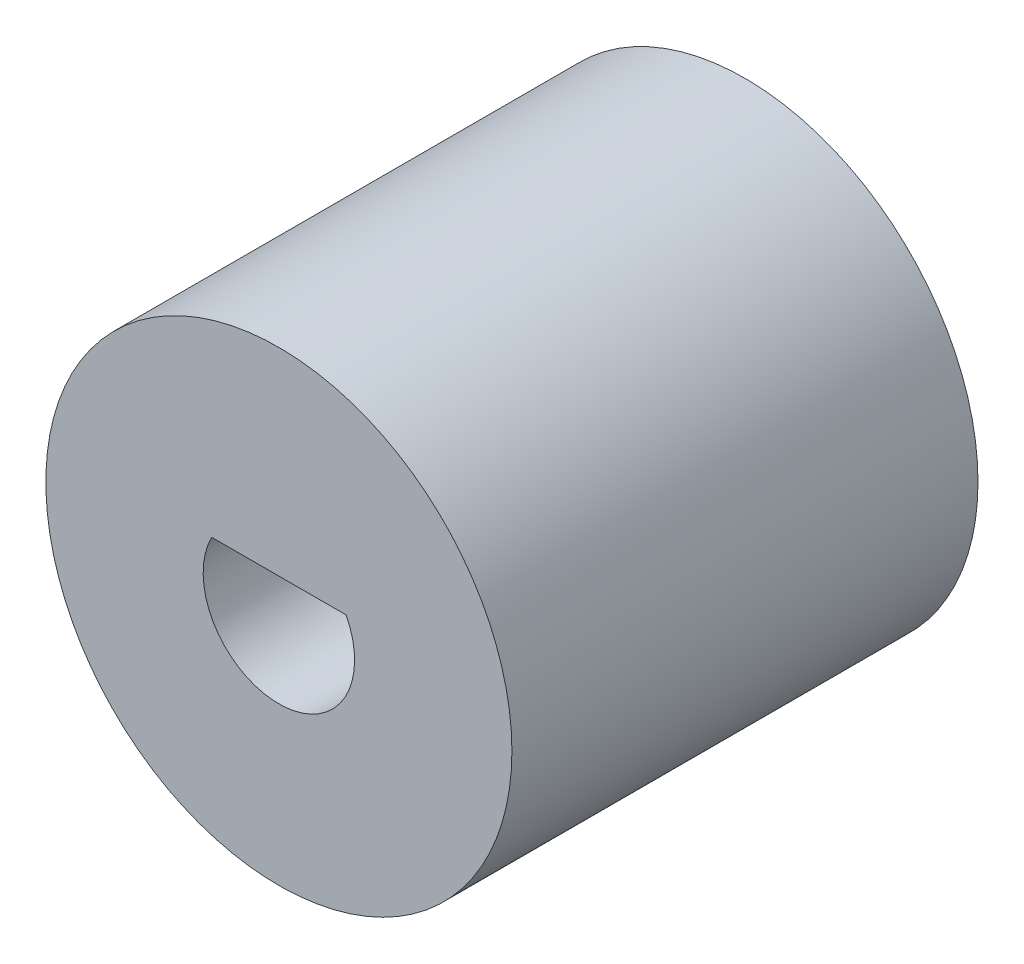
ISO-10303-21;
HEADER;
FILE_DESCRIPTION(('STEP AP214'),'2;1');
FILE_NAME('part.step','',(''),(''),'','','');
FILE_SCHEMA(('AUTOMOTIVE_DESIGN { 1 0 10303 214 1 1 1 1 }'));
ENDSEC;
DATA;
#1=APPLICATION_CONTEXT('core data for automotive mechanical design processes');
#2=APPLICATION_PROTOCOL_DEFINITION('international standard','automotive_design',2000,#1);
#3=PRODUCT_CONTEXT('',#1,'mechanical');
#4=PRODUCT('Part','Part','',(#3));
#5=PRODUCT_RELATED_PRODUCT_CATEGORY('part','',(#4));
#6=PRODUCT_DEFINITION_FORMATION('','',#4);
#7=PRODUCT_DEFINITION_CONTEXT('part definition',#1,'design');
#8=PRODUCT_DEFINITION('design','',#6,#7);
#9=PRODUCT_DEFINITION_SHAPE('','',#8);
#10=(LENGTH_UNIT() NAMED_UNIT(*) SI_UNIT(.MILLI.,.METRE.));
#11=(NAMED_UNIT(*) PLANE_ANGLE_UNIT() SI_UNIT($,.RADIAN.));
#12=(NAMED_UNIT(*) SI_UNIT($,.STERADIAN.) SOLID_ANGLE_UNIT());
#13=UNCERTAINTY_MEASURE_WITH_UNIT(LENGTH_MEASURE(1.E-05),#10,'distance_accuracy_value','');
#14=(GEOMETRIC_REPRESENTATION_CONTEXT(3) GLOBAL_UNCERTAINTY_ASSIGNED_CONTEXT((#13)) GLOBAL_UNIT_ASSIGNED_CONTEXT((#10,
#11,#12)) REPRESENTATION_CONTEXT('',''));
#15=CARTESIAN_POINT('',(0.,0.,0.));
#16=DIRECTION('',(0.,0.,1.));
#17=DIRECTION('',(1.,0.,0.));
#18=AXIS2_PLACEMENT_3D('',#15,#16,#17);
#19=CARTESIAN_POINT('',(0.,0.,10.));
#20=DIRECTION('',(0.,0.,-1.));
#21=DIRECTION('',(-1.,0.,0.));
#22=AXIS2_PLACEMENT_3D('',#19,#20,#21);
#23=CYLINDRICAL_SURFACE('',#22,5.);
#24=CARTESIAN_POINT('',(0.,0.,10.));
#25=DIRECTION('',(0.,0.,1.));
#26=DIRECTION('',(1.,0.,0.));
#27=AXIS2_PLACEMENT_3D('',#24,#25,#26);
#28=CIRCLE('',#27,5.);
#29=CARTESIAN_POINT('',(5.,0.,10.));
#30=VERTEX_POINT('',#29);
#31=EDGE_CURVE('E11',#30,#30,#28,.T.);
#32=ORIENTED_EDGE('',*,*,#31,.F.);
#33=EDGE_LOOP('',(#32));
#34=FACE_BOUND('',#33,.T.);
#35=CARTESIAN_POINT('',(0.,0.,0.));
#36=DIRECTION('',(0.,0.,1.));
#37=DIRECTION('',(1.,0.,0.));
#38=AXIS2_PLACEMENT_3D('',#35,#36,#37);
#39=CIRCLE('',#38,5.);
#40=CARTESIAN_POINT('',(5.,0.,0.));
#41=VERTEX_POINT('',#40);
#42=EDGE_CURVE('E42',#41,#41,#39,.T.);
#43=ORIENTED_EDGE('',*,*,#42,.T.);
#44=EDGE_LOOP('',(#43));
#45=FACE_BOUND('',#44,.T.);
#46=ADVANCED_FACE('F39',(#34,#45),#23,.T.);
#47=CARTESIAN_POINT('',(0.,0.,10.));
#48=DIRECTION('',(0.,0.,1.));
#49=DIRECTION('',(1.,0.,0.));
#50=AXIS2_PLACEMENT_3D('',#47,#48,#49);
#51=PLANE('',#50);
#52=CARTESIAN_POINT('',(0.,0.,10.));
#53=DIRECTION('',(0.,0.,1.));
#54=DIRECTION('',(1.,0.,0.));
#55=AXIS2_PLACEMENT_3D('',#52,#53,#54);
#56=CIRCLE('',#55,1.625);
#57=CARTESIAN_POINT('',(-1.44157032433385,0.75,10.));
#58=VERTEX_POINT('',#57);
#59=CARTESIAN_POINT('',(1.44157032433385,0.75,10.));
#60=VERTEX_POINT('',#59);
#61=EDGE_CURVE('E54',#58,#60,#56,.T.);
#62=ORIENTED_EDGE('',*,*,#61,.F.);
#63=DIRECTION('',(-1.,0.,0.));
#64=VECTOR('',#63,1.);
#65=CARTESIAN_POINT('',(-1.44157032433385,0.75,10.));
#66=LINE('',#65,#64);
#67=EDGE_CURVE('E77',#60,#58,#66,.T.);
#68=ORIENTED_EDGE('',*,*,#67,.F.);
#69=EDGE_LOOP('',(#62,#68));
#70=FACE_BOUND('',#69,.T.);
#71=ORIENTED_EDGE('',*,*,#31,.T.);
#72=EDGE_LOOP('',(#71));
#73=FACE_BOUND('',#72,.T.);
#74=ADVANCED_FACE('F94',(#70,#73),#51,.T.);
#75=CARTESIAN_POINT('',(0.,0.,0.));
#76=DIRECTION('',(0.,0.,1.));
#77=DIRECTION('',(1.,0.,0.));
#78=AXIS2_PLACEMENT_3D('',#75,#76,#77);
#79=PLANE('',#78);
#80=CARTESIAN_POINT('',(0.,0.,0.));
#81=DIRECTION('',(0.,0.,-1.));
#82=DIRECTION('',(-1.,0.,0.));
#83=AXIS2_PLACEMENT_3D('',#80,#81,#82);
#84=CIRCLE('',#83,2.9);
#85=CARTESIAN_POINT('',(-2.9,0.,0.));
#86=VERTEX_POINT('',#85);
#87=EDGE_CURVE('E86',#86,#86,#84,.T.);
#88=ORIENTED_EDGE('',*,*,#87,.F.);
#89=EDGE_LOOP('',(#88));
#90=FACE_BOUND('',#89,.T.);
#91=ORIENTED_EDGE('',*,*,#42,.F.);
#92=EDGE_LOOP('',(#91));
#93=FACE_BOUND('',#92,.T.);
#94=ADVANCED_FACE('F97',(#90,#93),#79,.F.);
#95=CARTESIAN_POINT('',(0.,0.,5.));
#96=DIRECTION('',(0.,0.,1.));
#97=DIRECTION('',(1.,0.,0.));
#98=AXIS2_PLACEMENT_3D('',#95,#96,#97);
#99=CYLINDRICAL_SURFACE('',#98,1.625);
#100=ORIENTED_EDGE('',*,*,#61,.T.);
#101=DIRECTION('',(0.,0.,1.));
#102=VECTOR('',#101,1.);
#103=CARTESIAN_POINT('',(1.44157032433385,0.75,5.));
#104=LINE('',#103,#102);
#105=CARTESIAN_POINT('',(1.44157032433385,0.75,5.));
#106=VERTEX_POINT('',#105);
#107=EDGE_CURVE('E71',#106,#60,#104,.T.);
#108=ORIENTED_EDGE('',*,*,#107,.F.);
#109=CARTESIAN_POINT('',(0.,0.,5.));
#110=DIRECTION('',(0.,0.,1.));
#111=DIRECTION('',(1.,0.,0.));
#112=AXIS2_PLACEMENT_3D('',#109,#110,#111);
#113=CIRCLE('',#112,1.625);
#114=CARTESIAN_POINT('',(-1.44157032433385,0.75,5.));
#115=VERTEX_POINT('',#114);
#116=EDGE_CURVE('E62',#115,#106,#113,.T.);
#117=ORIENTED_EDGE('',*,*,#116,.F.);
#118=DIRECTION('',(0.,0.,1.));
#119=VECTOR('',#118,1.);
#120=CARTESIAN_POINT('',(-1.44157032433385,0.75,5.));
#121=LINE('',#120,#119);
#122=EDGE_CURVE('E74',#115,#58,#121,.T.);
#123=ORIENTED_EDGE('',*,*,#122,.T.);
#124=EDGE_LOOP('',(#100,#108,#117,#123));
#125=FACE_BOUND('',#124,.T.);
#126=ADVANCED_FACE('F80',(#125),#99,.F.);
#127=CARTESIAN_POINT('',(-1.44157032433385,0.75,5.));
#128=DIRECTION('',(0.,1.,0.));
#129=DIRECTION('',(0.,0.,1.));
#130=AXIS2_PLACEMENT_3D('',#127,#128,#129);
#131=PLANE('',#130);
#132=ORIENTED_EDGE('',*,*,#67,.T.);
#133=ORIENTED_EDGE('',*,*,#122,.F.);
#134=DIRECTION('',(-1.,0.,0.));
#135=VECTOR('',#134,1.);
#136=CARTESIAN_POINT('',(-1.44157032433385,0.75,5.));
#137=LINE('',#136,#135);
#138=EDGE_CURVE('E66',#106,#115,#137,.T.);
#139=ORIENTED_EDGE('',*,*,#138,.F.);
#140=ORIENTED_EDGE('',*,*,#107,.T.);
#141=EDGE_LOOP('',(#132,#133,#139,#140));
#142=FACE_BOUND('',#141,.T.);
#143=ADVANCED_FACE('F75',(#142),#131,.F.);
#144=CARTESIAN_POINT('',(0.,0.,5.));
#145=DIRECTION('',(0.,0.,-1.));
#146=DIRECTION('',(-1.,0.,0.));
#147=AXIS2_PLACEMENT_3D('',#144,#145,#146);
#148=PLANE('',#147);
#149=CARTESIAN_POINT('',(0.,0.,5.));
#150=DIRECTION('',(0.,0.,-1.));
#151=DIRECTION('',(-1.,0.,0.));
#152=AXIS2_PLACEMENT_3D('',#149,#150,#151);
#153=CIRCLE('',#152,2.9);
#154=CARTESIAN_POINT('',(-2.9,0.,5.));
#155=VERTEX_POINT('',#154);
#156=EDGE_CURVE('E90',#155,#155,#153,.T.);
#157=ORIENTED_EDGE('',*,*,#156,.T.);
#158=EDGE_LOOP('',(#157));
#159=FACE_BOUND('',#158,.T.);
#160=ORIENTED_EDGE('',*,*,#116,.T.);
#161=ORIENTED_EDGE('',*,*,#138,.T.);
#162=EDGE_LOOP('',(#160,#161));
#163=FACE_BOUND('',#162,.T.);
#164=ADVANCED_FACE('F68',(#159,#163),#148,.T.);
#165=CARTESIAN_POINT('',(0.,0.,5.));
#166=DIRECTION('',(0.,0.,-1.));
#167=DIRECTION('',(-1.,0.,0.));
#168=AXIS2_PLACEMENT_3D('',#165,#166,#167);
#169=CYLINDRICAL_SURFACE('',#168,2.9);
#170=ORIENTED_EDGE('',*,*,#156,.F.);
#171=EDGE_LOOP('',(#170));
#172=FACE_BOUND('',#171,.T.);
#173=ORIENTED_EDGE('',*,*,#87,.T.);
#174=EDGE_LOOP('',(#173));
#175=FACE_BOUND('',#174,.T.);
#176=ADVANCED_FACE('F117',(#172,#175),#169,.F.);
#177=CLOSED_SHELL('',(#46,#74,#94,#126,#143,#164,#176));
#178=MANIFOLD_SOLID_BREP('B2',#177);
#179=ADVANCED_BREP_SHAPE_REPRESENTATION('',(#18,#178),#14);
#180=SHAPE_DEFINITION_REPRESENTATION(#9,#179);
ENDSEC;
END-ISO-10303-21;
